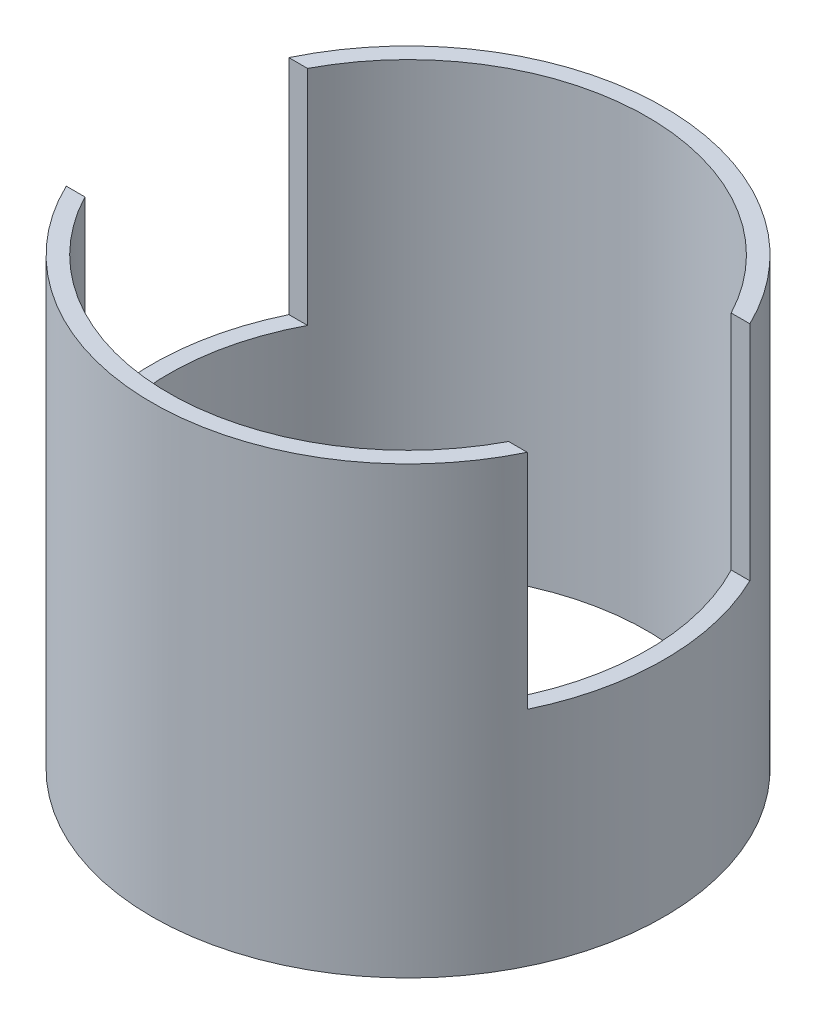
ISO-10303-21;
HEADER;
FILE_DESCRIPTION(('STEP AP214'),'2;1');
FILE_NAME('part.step','',(''),(''),'','','');
FILE_SCHEMA(('AUTOMOTIVE_DESIGN { 1 0 10303 214 1 1 1 1 }'));
ENDSEC;
DATA;
#1=APPLICATION_CONTEXT('core data for automotive mechanical design processes');
#2=APPLICATION_PROTOCOL_DEFINITION('international standard','automotive_design',2000,#1);
#3=PRODUCT_CONTEXT('',#1,'mechanical');
#4=PRODUCT('Part','Part','',(#3));
#5=PRODUCT_RELATED_PRODUCT_CATEGORY('part','',(#4));
#6=PRODUCT_DEFINITION_FORMATION('','',#4);
#7=PRODUCT_DEFINITION_CONTEXT('part definition',#1,'design');
#8=PRODUCT_DEFINITION('design','',#6,#7);
#9=PRODUCT_DEFINITION_SHAPE('','',#8);
#10=(LENGTH_UNIT() NAMED_UNIT(*) SI_UNIT(.MILLI.,.METRE.));
#11=(NAMED_UNIT(*) PLANE_ANGLE_UNIT() SI_UNIT($,.RADIAN.));
#12=(NAMED_UNIT(*) SI_UNIT($,.STERADIAN.) SOLID_ANGLE_UNIT());
#13=UNCERTAINTY_MEASURE_WITH_UNIT(LENGTH_MEASURE(1.E-05),#10,'distance_accuracy_value','');
#14=(GEOMETRIC_REPRESENTATION_CONTEXT(3) GLOBAL_UNCERTAINTY_ASSIGNED_CONTEXT((#13)) GLOBAL_UNIT_ASSIGNED_CONTEXT((#10,
#11,#12)) REPRESENTATION_CONTEXT('',''));
#15=CARTESIAN_POINT('',(0.,0.,0.));
#16=DIRECTION('',(0.,0.,1.));
#17=DIRECTION('',(1.,0.,0.));
#18=AXIS2_PLACEMENT_3D('',#15,#16,#17);
#19=CARTESIAN_POINT('',(0.,40.,0.));
#20=DIRECTION('',(0.,1.,0.));
#21=DIRECTION('',(0.,0.,1.));
#22=AXIS2_PLACEMENT_3D('',#19,#20,#21);
#23=PLANE('',#22);
#24=DIRECTION('',(1.,0.,0.));
#25=VECTOR('',#24,1.);
#26=CARTESIAN_POINT('',(-30.,40.,10.));
#27=LINE('',#26,#25);
#28=CARTESIAN_POINT('',(-20.712315177208,40.,10.));
#29=VERTEX_POINT('',#28);
#30=CARTESIAN_POINT('',(-19.0328663106743,40.,10.));
#31=VERTEX_POINT('',#30);
#32=EDGE_CURVE('E168',#29,#31,#27,.T.);
#33=ORIENTED_EDGE('',*,*,#32,.F.);
#34=CARTESIAN_POINT('',(0.,40.,0.));
#35=DIRECTION('',(0.,1.,0.));
#36=DIRECTION('',(0.,0.,1.));
#37=AXIS2_PLACEMENT_3D('',#34,#35,#36);
#38=CIRCLE('',#37,23.);
#39=CARTESIAN_POINT('',(20.712315177208,40.,10.));
#40=VERTEX_POINT('',#39);
#41=EDGE_CURVE('E122',#29,#40,#38,.T.);
#42=ORIENTED_EDGE('',*,*,#41,.T.);
#43=CARTESIAN_POINT('',(19.0328663106743,40.,10.));
#44=VERTEX_POINT('',#43);
#45=EDGE_CURVE('E115',#44,#40,#27,.T.);
#46=ORIENTED_EDGE('',*,*,#45,.F.);
#47=CARTESIAN_POINT('',(0.,40.,0.));
#48=DIRECTION('',(0.,1.,0.));
#49=DIRECTION('',(0.,0.,1.));
#50=AXIS2_PLACEMENT_3D('',#47,#48,#49);
#51=CIRCLE('',#50,21.5);
#52=EDGE_CURVE('E154',#31,#44,#51,.T.);
#53=ORIENTED_EDGE('',*,*,#52,.F.);
#54=EDGE_LOOP('',(#33,#42,#46,#53));
#55=FACE_BOUND('',#54,.T.);
#56=ADVANCED_FACE('F33',(#55),#23,.T.);
#57=DIRECTION('',(-1.,0.,0.));
#58=VECTOR('',#57,1.);
#59=CARTESIAN_POINT('',(-30.,40.,-10.));
#60=LINE('',#59,#58);
#61=CARTESIAN_POINT('',(20.712315177208,40.,-10.));
#62=VERTEX_POINT('',#61);
#63=CARTESIAN_POINT('',(19.0328663106743,40.,-10.));
#64=VERTEX_POINT('',#63);
#65=EDGE_CURVE('E99',#62,#64,#60,.T.);
#66=ORIENTED_EDGE('',*,*,#65,.F.);
#67=CARTESIAN_POINT('',(-20.712315177208,40.,-10.));
#68=VERTEX_POINT('',#67);
#69=EDGE_CURVE('E112',#62,#68,#38,.T.);
#70=ORIENTED_EDGE('',*,*,#69,.T.);
#71=CARTESIAN_POINT('',(-19.0328663106743,40.,-10.));
#72=VERTEX_POINT('',#71);
#73=EDGE_CURVE('E116',#72,#68,#60,.T.);
#74=ORIENTED_EDGE('',*,*,#73,.F.);
#75=EDGE_CURVE('E114',#64,#72,#51,.T.);
#76=ORIENTED_EDGE('',*,*,#75,.F.);
#77=EDGE_LOOP('',(#66,#70,#74,#76));
#78=FACE_BOUND('',#77,.T.);
#79=ADVANCED_FACE('F110',(#78),#23,.T.);
#80=CARTESIAN_POINT('',(0.,0.,0.));
#81=DIRECTION('',(0.,1.,0.));
#82=DIRECTION('',(0.,0.,1.));
#83=AXIS2_PLACEMENT_3D('',#80,#81,#82);
#84=PLANE('',#83);
#85=CARTESIAN_POINT('',(0.,0.,0.));
#86=DIRECTION('',(0.,1.,0.));
#87=DIRECTION('',(0.,0.,1.));
#88=AXIS2_PLACEMENT_3D('',#85,#86,#87);
#89=CIRCLE('',#88,23.);
#90=CARTESIAN_POINT('',(0.,0.,23.));
#91=VERTEX_POINT('',#90);
#92=EDGE_CURVE('E128',#91,#91,#89,.T.);
#93=ORIENTED_EDGE('',*,*,#92,.F.);
#94=EDGE_LOOP('',(#93));
#95=FACE_BOUND('',#94,.T.);
#96=CARTESIAN_POINT('',(0.,0.,0.));
#97=DIRECTION('',(0.,1.,0.));
#98=DIRECTION('',(0.,0.,1.));
#99=AXIS2_PLACEMENT_3D('',#96,#97,#98);
#100=CIRCLE('',#99,21.5);
#101=CARTESIAN_POINT('',(0.,0.,21.5));
#102=VERTEX_POINT('',#101);
#103=EDGE_CURVE('E131',#102,#102,#100,.T.);
#104=ORIENTED_EDGE('',*,*,#103,.T.);
#105=EDGE_LOOP('',(#104));
#106=FACE_BOUND('',#105,.T.);
#107=ADVANCED_FACE('F194',(#95,#106),#84,.F.);
#108=CARTESIAN_POINT('',(0.,40.,0.));
#109=DIRECTION('',(0.,-1.,0.));
#110=DIRECTION('',(0.,0.,-1.));
#111=AXIS2_PLACEMENT_3D('',#108,#109,#110);
#112=CYLINDRICAL_SURFACE('',#111,23.);
#113=CARTESIAN_POINT('',(0.,20.,0.));
#114=DIRECTION('',(0.,-1.,0.));
#115=DIRECTION('',(0.,0.,-1.));
#116=AXIS2_PLACEMENT_3D('',#113,#114,#115);
#117=CIRCLE('',#116,23.);
#118=CARTESIAN_POINT('',(20.712315177208,20.,-10.));
#119=VERTEX_POINT('',#118);
#120=CARTESIAN_POINT('',(20.712315177208,20.,10.));
#121=VERTEX_POINT('',#120);
#122=EDGE_CURVE('E165',#119,#121,#117,.T.);
#123=ORIENTED_EDGE('',*,*,#122,.T.);
#124=DIRECTION('',(0.,-1.,0.));
#125=VECTOR('',#124,1.);
#126=CARTESIAN_POINT('',(20.712315177208,40.,10.));
#127=LINE('',#126,#125);
#128=EDGE_CURVE('E104',#121,#40,#127,.F.);
#129=ORIENTED_EDGE('',*,*,#128,.T.);
#130=ORIENTED_EDGE('',*,*,#41,.F.);
#131=DIRECTION('',(0.,-1.,0.));
#132=VECTOR('',#131,1.);
#133=CARTESIAN_POINT('',(-20.712315177208,40.,10.));
#134=LINE('',#133,#132);
#135=CARTESIAN_POINT('',(-20.712315177208,20.,10.));
#136=VERTEX_POINT('',#135);
#137=EDGE_CURVE('E159',#29,#136,#134,.T.);
#138=ORIENTED_EDGE('',*,*,#137,.T.);
#139=CARTESIAN_POINT('',(-20.712315177208,20.,-10.));
#140=VERTEX_POINT('',#139);
#141=EDGE_CURVE('E166',#136,#140,#117,.T.);
#142=ORIENTED_EDGE('',*,*,#141,.T.);
#143=DIRECTION('',(0.,-1.,0.));
#144=VECTOR('',#143,1.);
#145=CARTESIAN_POINT('',(-20.712315177208,40.,-10.));
#146=LINE('',#145,#144);
#147=EDGE_CURVE('E105',#140,#68,#146,.F.);
#148=ORIENTED_EDGE('',*,*,#147,.T.);
#149=ORIENTED_EDGE('',*,*,#69,.F.);
#150=DIRECTION('',(0.,-1.,0.));
#151=VECTOR('',#150,1.);
#152=CARTESIAN_POINT('',(20.712315177208,40.,-10.));
#153=LINE('',#152,#151);
#154=EDGE_CURVE('E96',#62,#119,#153,.T.);
#155=ORIENTED_EDGE('',*,*,#154,.T.);
#156=EDGE_LOOP('',(#123,#129,#130,#138,#142,#148,#149,#155));
#157=FACE_BOUND('',#156,.T.);
#158=ORIENTED_EDGE('',*,*,#92,.T.);
#159=EDGE_LOOP('',(#158));
#160=FACE_BOUND('',#159,.T.);
#161=ADVANCED_FACE('F35',(#157,#160),#112,.T.);
#162=CARTESIAN_POINT('',(0.,40.,0.));
#163=DIRECTION('',(0.,-1.,0.));
#164=DIRECTION('',(0.,0.,-1.));
#165=AXIS2_PLACEMENT_3D('',#162,#163,#164);
#166=CYLINDRICAL_SURFACE('',#165,21.5);
#167=DIRECTION('',(0.,-1.,0.));
#168=VECTOR('',#167,1.);
#169=CARTESIAN_POINT('',(19.0328663106743,40.,10.));
#170=LINE('',#169,#168);
#171=CARTESIAN_POINT('',(19.0328663106743,20.,10.));
#172=VERTEX_POINT('',#171);
#173=EDGE_CURVE('E11',#172,#44,#170,.F.);
#174=ORIENTED_EDGE('',*,*,#173,.F.);
#175=CARTESIAN_POINT('',(0.,20.,0.));
#176=DIRECTION('',(0.,-1.,0.));
#177=DIRECTION('',(0.,0.,-1.));
#178=AXIS2_PLACEMENT_3D('',#175,#176,#177);
#179=CIRCLE('',#178,21.5);
#180=CARTESIAN_POINT('',(19.0328663106743,20.,-10.));
#181=VERTEX_POINT('',#180);
#182=EDGE_CURVE('E126',#181,#172,#179,.T.);
#183=ORIENTED_EDGE('',*,*,#182,.F.);
#184=DIRECTION('',(0.,-1.,0.));
#185=VECTOR('',#184,1.);
#186=CARTESIAN_POINT('',(19.0328663106743,40.,-10.));
#187=LINE('',#186,#185);
#188=EDGE_CURVE('E41',#64,#181,#187,.T.);
#189=ORIENTED_EDGE('',*,*,#188,.F.);
#190=ORIENTED_EDGE('',*,*,#75,.T.);
#191=DIRECTION('',(0.,-1.,0.));
#192=VECTOR('',#191,1.);
#193=CARTESIAN_POINT('',(-19.0328663106743,40.,-10.));
#194=LINE('',#193,#192);
#195=CARTESIAN_POINT('',(-19.0328663106743,20.,-10.));
#196=VERTEX_POINT('',#195);
#197=EDGE_CURVE('E124',#196,#72,#194,.F.);
#198=ORIENTED_EDGE('',*,*,#197,.F.);
#199=CARTESIAN_POINT('',(-19.0328663106743,20.,10.));
#200=VERTEX_POINT('',#199);
#201=EDGE_CURVE('E121',#200,#196,#179,.T.);
#202=ORIENTED_EDGE('',*,*,#201,.F.);
#203=DIRECTION('',(0.,-1.,0.));
#204=VECTOR('',#203,1.);
#205=CARTESIAN_POINT('',(-19.0328663106743,40.,10.));
#206=LINE('',#205,#204);
#207=EDGE_CURVE('E136',#31,#200,#206,.T.);
#208=ORIENTED_EDGE('',*,*,#207,.F.);
#209=ORIENTED_EDGE('',*,*,#52,.T.);
#210=EDGE_LOOP('',(#174,#183,#189,#190,#198,#202,#208,#209));
#211=FACE_BOUND('',#210,.T.);
#212=ORIENTED_EDGE('',*,*,#103,.F.);
#213=EDGE_LOOP('',(#212));
#214=FACE_BOUND('',#213,.T.);
#215=ADVANCED_FACE('F150',(#211,#214),#166,.F.);
#216=CARTESIAN_POINT('',(0.,20.,0.));
#217=DIRECTION('',(0.,-1.,0.));
#218=DIRECTION('',(0.,0.,-1.));
#219=AXIS2_PLACEMENT_3D('',#216,#217,#218);
#220=PLANE('',#219);
#221=DIRECTION('',(1.,0.,0.));
#222=VECTOR('',#221,1.);
#223=CARTESIAN_POINT('',(-30.,20.,10.));
#224=LINE('',#223,#222);
#225=EDGE_CURVE('E56',#136,#200,#224,.T.);
#226=ORIENTED_EDGE('',*,*,#225,.T.);
#227=ORIENTED_EDGE('',*,*,#201,.T.);
#228=DIRECTION('',(-1.,0.,0.));
#229=VECTOR('',#228,1.);
#230=CARTESIAN_POINT('',(-30.,20.,-10.));
#231=LINE('',#230,#229);
#232=EDGE_CURVE('E170',#196,#140,#231,.T.);
#233=ORIENTED_EDGE('',*,*,#232,.T.);
#234=ORIENTED_EDGE('',*,*,#141,.F.);
#235=EDGE_LOOP('',(#226,#227,#233,#234));
#236=FACE_BOUND('',#235,.T.);
#237=ADVANCED_FACE('F176',(#236),#220,.F.);
#238=CARTESIAN_POINT('',(-30.,20.,-10.));
#239=DIRECTION('',(0.,0.,-1.));
#240=DIRECTION('',(-1.,0.,0.));
#241=AXIS2_PLACEMENT_3D('',#238,#239,#240);
#242=PLANE('',#241);
#243=ORIENTED_EDGE('',*,*,#232,.F.);
#244=ORIENTED_EDGE('',*,*,#197,.T.);
#245=ORIENTED_EDGE('',*,*,#73,.T.);
#246=ORIENTED_EDGE('',*,*,#147,.F.);
#247=EDGE_LOOP('',(#243,#244,#245,#246));
#248=FACE_BOUND('',#247,.T.);
#249=ADVANCED_FACE('F178',(#248),#242,.F.);
#250=CARTESIAN_POINT('',(-30.,20.,10.));
#251=DIRECTION('',(0.,0.,1.));
#252=DIRECTION('',(1.,0.,0.));
#253=AXIS2_PLACEMENT_3D('',#250,#251,#252);
#254=PLANE('',#253);
#255=ORIENTED_EDGE('',*,*,#32,.T.);
#256=ORIENTED_EDGE('',*,*,#207,.T.);
#257=ORIENTED_EDGE('',*,*,#225,.F.);
#258=ORIENTED_EDGE('',*,*,#137,.F.);
#259=EDGE_LOOP('',(#255,#256,#257,#258));
#260=FACE_BOUND('',#259,.T.);
#261=ADVANCED_FACE('F174',(#260),#254,.F.);
#262=EDGE_CURVE('E141',#172,#121,#224,.T.);
#263=ORIENTED_EDGE('',*,*,#262,.F.);
#264=ORIENTED_EDGE('',*,*,#173,.T.);
#265=ORIENTED_EDGE('',*,*,#45,.T.);
#266=ORIENTED_EDGE('',*,*,#128,.F.);
#267=EDGE_LOOP('',(#263,#264,#265,#266));
#268=FACE_BOUND('',#267,.T.);
#269=ADVANCED_FACE('F145',(#268),#254,.F.);
#270=ORIENTED_EDGE('',*,*,#65,.T.);
#271=ORIENTED_EDGE('',*,*,#188,.T.);
#272=EDGE_CURVE('E48',#119,#181,#231,.T.);
#273=ORIENTED_EDGE('',*,*,#272,.F.);
#274=ORIENTED_EDGE('',*,*,#154,.F.);
#275=EDGE_LOOP('',(#270,#271,#273,#274));
#276=FACE_BOUND('',#275,.T.);
#277=ADVANCED_FACE('F98',(#276),#242,.F.);
#278=ORIENTED_EDGE('',*,*,#272,.T.);
#279=ORIENTED_EDGE('',*,*,#182,.T.);
#280=ORIENTED_EDGE('',*,*,#262,.T.);
#281=ORIENTED_EDGE('',*,*,#122,.F.);
#282=EDGE_LOOP('',(#278,#279,#280,#281));
#283=FACE_BOUND('',#282,.T.);
#284=ADVANCED_FACE('F140',(#283),#220,.F.);
#285=CLOSED_SHELL('',(#56,#79,#107,#161,#215,#237,#249,#261,#269,#277,#284));
#286=MANIFOLD_SOLID_BREP('B2',#285);
#287=ADVANCED_BREP_SHAPE_REPRESENTATION('',(#18,#286),#14);
#288=SHAPE_DEFINITION_REPRESENTATION(#9,#287);
ENDSEC;
END-ISO-10303-21;
